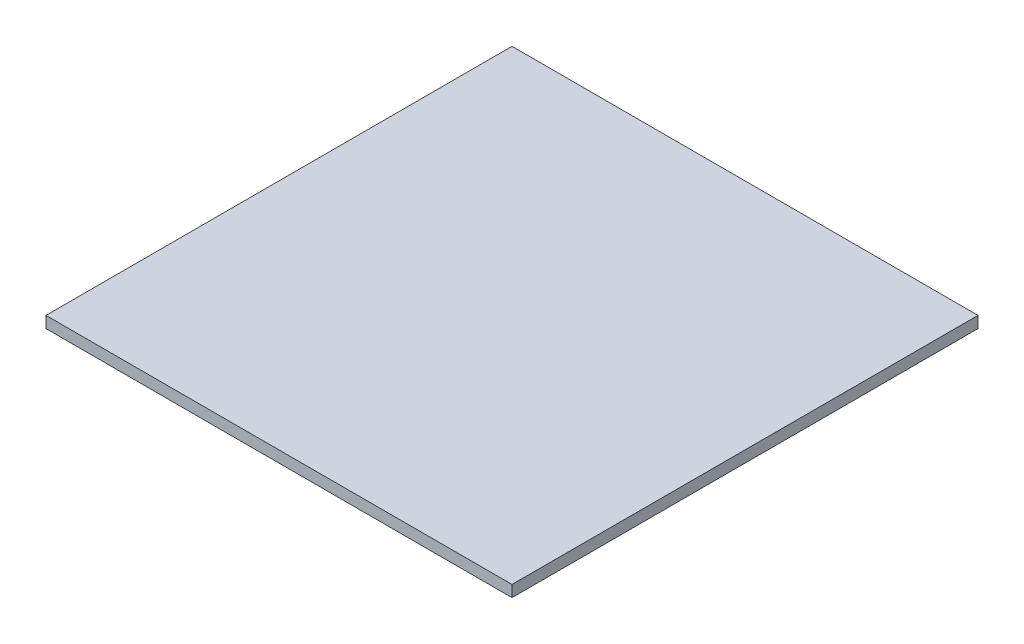
ISO-10303-21;
HEADER;
FILE_DESCRIPTION(('STEP AP214'),'2;1');
FILE_NAME('part.step','',(''),(''),'','','');
FILE_SCHEMA(('AUTOMOTIVE_DESIGN { 1 0 10303 214 1 1 1 1 }'));
ENDSEC;
DATA;
#1=APPLICATION_CONTEXT('core data for automotive mechanical design processes');
#2=APPLICATION_PROTOCOL_DEFINITION('international standard','automotive_design',2000,#1);
#3=PRODUCT_CONTEXT('',#1,'mechanical');
#4=PRODUCT('Part','Part','',(#3));
#5=PRODUCT_RELATED_PRODUCT_CATEGORY('part','',(#4));
#6=PRODUCT_DEFINITION_FORMATION('','',#4);
#7=PRODUCT_DEFINITION_CONTEXT('part definition',#1,'design');
#8=PRODUCT_DEFINITION('design','',#6,#7);
#9=PRODUCT_DEFINITION_SHAPE('','',#8);
#10=(LENGTH_UNIT() NAMED_UNIT(*) SI_UNIT(.MILLI.,.METRE.));
#11=(NAMED_UNIT(*) PLANE_ANGLE_UNIT() SI_UNIT($,.RADIAN.));
#12=(NAMED_UNIT(*) SI_UNIT($,.STERADIAN.) SOLID_ANGLE_UNIT());
#13=UNCERTAINTY_MEASURE_WITH_UNIT(LENGTH_MEASURE(1.E-05),#10,'distance_accuracy_value','');
#14=(GEOMETRIC_REPRESENTATION_CONTEXT(3) GLOBAL_UNCERTAINTY_ASSIGNED_CONTEXT((#13)) GLOBAL_UNIT_ASSIGNED_CONTEXT((#10,
#11,#12)) REPRESENTATION_CONTEXT('',''));
#15=CARTESIAN_POINT('',(0.,0.,0.));
#16=DIRECTION('',(0.,0.,1.));
#17=DIRECTION('',(1.,0.,0.));
#18=AXIS2_PLACEMENT_3D('',#15,#16,#17);
#19=CARTESIAN_POINT('',(61.,3.,61.));
#20=DIRECTION('',(-1.,0.,0.));
#21=DIRECTION('',(0.,0.,1.));
#22=AXIS2_PLACEMENT_3D('',#19,#20,#21);
#23=PLANE('',#22);
#24=DIRECTION('',(0.,0.,-1.));
#25=VECTOR('',#24,1.);
#26=CARTESIAN_POINT('',(61.,0.,61.));
#27=LINE('',#26,#25);
#28=CARTESIAN_POINT('',(61.,0.,61.));
#29=VERTEX_POINT('',#28);
#30=CARTESIAN_POINT('',(61.,0.,-61.));
#31=VERTEX_POINT('',#30);
#32=EDGE_CURVE('E96',#29,#31,#27,.T.);
#33=ORIENTED_EDGE('',*,*,#32,.T.);
#34=DIRECTION('',(0.,-1.,0.));
#35=VECTOR('',#34,1.);
#36=CARTESIAN_POINT('',(61.,3.,-61.));
#37=LINE('',#36,#35);
#38=CARTESIAN_POINT('',(61.,3.,-61.));
#39=VERTEX_POINT('',#38);
#40=EDGE_CURVE('E11',#39,#31,#37,.T.);
#41=ORIENTED_EDGE('',*,*,#40,.F.);
#42=DIRECTION('',(0.,0.,-1.));
#43=VECTOR('',#42,1.);
#44=CARTESIAN_POINT('',(61.,3.,61.));
#45=LINE('',#44,#43);
#46=CARTESIAN_POINT('',(61.,3.,61.));
#47=VERTEX_POINT('',#46);
#48=EDGE_CURVE('E84',#47,#39,#45,.T.);
#49=ORIENTED_EDGE('',*,*,#48,.F.);
#50=DIRECTION('',(0.,-1.,0.));
#51=VECTOR('',#50,1.);
#52=CARTESIAN_POINT('',(61.,3.,61.));
#53=LINE('',#52,#51);
#54=EDGE_CURVE('E92',#47,#29,#53,.T.);
#55=ORIENTED_EDGE('',*,*,#54,.T.);
#56=EDGE_LOOP('',(#33,#41,#49,#55));
#57=FACE_BOUND('',#56,.T.);
#58=ADVANCED_FACE('F33',(#57),#23,.F.);
#59=CARTESIAN_POINT('',(-61.,3.,-61.));
#60=DIRECTION('',(0.,0.,1.));
#61=DIRECTION('',(1.,0.,0.));
#62=AXIS2_PLACEMENT_3D('',#59,#60,#61);
#63=PLANE('',#62);
#64=DIRECTION('',(-1.,0.,0.));
#65=VECTOR('',#64,1.);
#66=CARTESIAN_POINT('',(-61.,0.,-61.));
#67=LINE('',#66,#65);
#68=CARTESIAN_POINT('',(-61.,0.,-61.));
#69=VERTEX_POINT('',#68);
#70=EDGE_CURVE('E88',#31,#69,#67,.T.);
#71=ORIENTED_EDGE('',*,*,#70,.T.);
#72=DIRECTION('',(0.,-1.,0.));
#73=VECTOR('',#72,1.);
#74=CARTESIAN_POINT('',(-61.,3.,-61.));
#75=LINE('',#74,#73);
#76=CARTESIAN_POINT('',(-61.,3.,-61.));
#77=VERTEX_POINT('',#76);
#78=EDGE_CURVE('E41',#77,#69,#75,.T.);
#79=ORIENTED_EDGE('',*,*,#78,.F.);
#80=DIRECTION('',(-1.,0.,0.));
#81=VECTOR('',#80,1.);
#82=CARTESIAN_POINT('',(-61.,3.,-61.));
#83=LINE('',#82,#81);
#84=EDGE_CURVE('E79',#39,#77,#83,.T.);
#85=ORIENTED_EDGE('',*,*,#84,.F.);
#86=ORIENTED_EDGE('',*,*,#40,.T.);
#87=EDGE_LOOP('',(#71,#79,#85,#86));
#88=FACE_BOUND('',#87,.T.);
#89=ADVANCED_FACE('F87',(#88),#63,.F.);
#90=CARTESIAN_POINT('',(-61.,3.,61.));
#91=DIRECTION('',(1.,0.,0.));
#92=DIRECTION('',(0.,0.,-1.));
#93=AXIS2_PLACEMENT_3D('',#90,#91,#92);
#94=PLANE('',#93);
#95=DIRECTION('',(0.,0.,1.));
#96=VECTOR('',#95,1.);
#97=CARTESIAN_POINT('',(-61.,0.,61.));
#98=LINE('',#97,#96);
#99=CARTESIAN_POINT('',(-61.,0.,61.));
#100=VERTEX_POINT('',#99);
#101=EDGE_CURVE('E66',#69,#100,#98,.T.);
#102=ORIENTED_EDGE('',*,*,#101,.T.);
#103=DIRECTION('',(0.,-1.,0.));
#104=VECTOR('',#103,1.);
#105=CARTESIAN_POINT('',(-61.,3.,61.));
#106=LINE('',#105,#104);
#107=CARTESIAN_POINT('',(-61.,3.,61.));
#108=VERTEX_POINT('',#107);
#109=EDGE_CURVE('E89',#108,#100,#106,.T.);
#110=ORIENTED_EDGE('',*,*,#109,.F.);
#111=DIRECTION('',(0.,0.,1.));
#112=VECTOR('',#111,1.);
#113=CARTESIAN_POINT('',(-61.,3.,61.));
#114=LINE('',#113,#112);
#115=EDGE_CURVE('E82',#77,#108,#114,.T.);
#116=ORIENTED_EDGE('',*,*,#115,.F.);
#117=ORIENTED_EDGE('',*,*,#78,.T.);
#118=EDGE_LOOP('',(#102,#110,#116,#117));
#119=FACE_BOUND('',#118,.T.);
#120=ADVANCED_FACE('F90',(#119),#94,.F.);
#121=CARTESIAN_POINT('',(-61.,3.,61.));
#122=DIRECTION('',(0.,0.,-1.));
#123=DIRECTION('',(-1.,0.,0.));
#124=AXIS2_PLACEMENT_3D('',#121,#122,#123);
#125=PLANE('',#124);
#126=DIRECTION('',(1.,0.,0.));
#127=VECTOR('',#126,1.);
#128=CARTESIAN_POINT('',(-61.,0.,61.));
#129=LINE('',#128,#127);
#130=EDGE_CURVE('E72',#100,#29,#129,.T.);
#131=ORIENTED_EDGE('',*,*,#130,.T.);
#132=ORIENTED_EDGE('',*,*,#54,.F.);
#133=DIRECTION('',(1.,0.,0.));
#134=VECTOR('',#133,1.);
#135=CARTESIAN_POINT('',(-61.,3.,61.));
#136=LINE('',#135,#134);
#137=EDGE_CURVE('E49',#108,#47,#136,.T.);
#138=ORIENTED_EDGE('',*,*,#137,.F.);
#139=ORIENTED_EDGE('',*,*,#109,.T.);
#140=EDGE_LOOP('',(#131,#132,#138,#139));
#141=FACE_BOUND('',#140,.T.);
#142=ADVANCED_FACE('F103',(#141),#125,.F.);
#143=CARTESIAN_POINT('',(0.,3.,0.));
#144=DIRECTION('',(0.,-1.,0.));
#145=DIRECTION('',(0.,0.,-1.));
#146=AXIS2_PLACEMENT_3D('',#143,#144,#145);
#147=PLANE('',#146);
#148=ORIENTED_EDGE('',*,*,#48,.T.);
#149=ORIENTED_EDGE('',*,*,#84,.T.);
#150=ORIENTED_EDGE('',*,*,#115,.T.);
#151=ORIENTED_EDGE('',*,*,#137,.T.);
#152=EDGE_LOOP('',(#148,#149,#150,#151));
#153=FACE_BOUND('',#152,.T.);
#154=ADVANCED_FACE('F80',(#153),#147,.F.);
#155=CARTESIAN_POINT('',(0.,0.,0.));
#156=DIRECTION('',(0.,-1.,0.));
#157=DIRECTION('',(0.,0.,-1.));
#158=AXIS2_PLACEMENT_3D('',#155,#156,#157);
#159=PLANE('',#158);
#160=ORIENTED_EDGE('',*,*,#32,.F.);
#161=ORIENTED_EDGE('',*,*,#130,.F.);
#162=ORIENTED_EDGE('',*,*,#101,.F.);
#163=ORIENTED_EDGE('',*,*,#70,.F.);
#164=EDGE_LOOP('',(#160,#161,#162,#163));
#165=FACE_BOUND('',#164,.T.);
#166=ADVANCED_FACE('F106',(#165),#159,.T.);
#167=CLOSED_SHELL('',(#58,#89,#120,#142,#154,#166));
#168=MANIFOLD_SOLID_BREP('B2',#167);
#169=ADVANCED_BREP_SHAPE_REPRESENTATION('',(#18,#168),#14);
#170=SHAPE_DEFINITION_REPRESENTATION(#9,#169);
ENDSEC;
END-ISO-10303-21;
